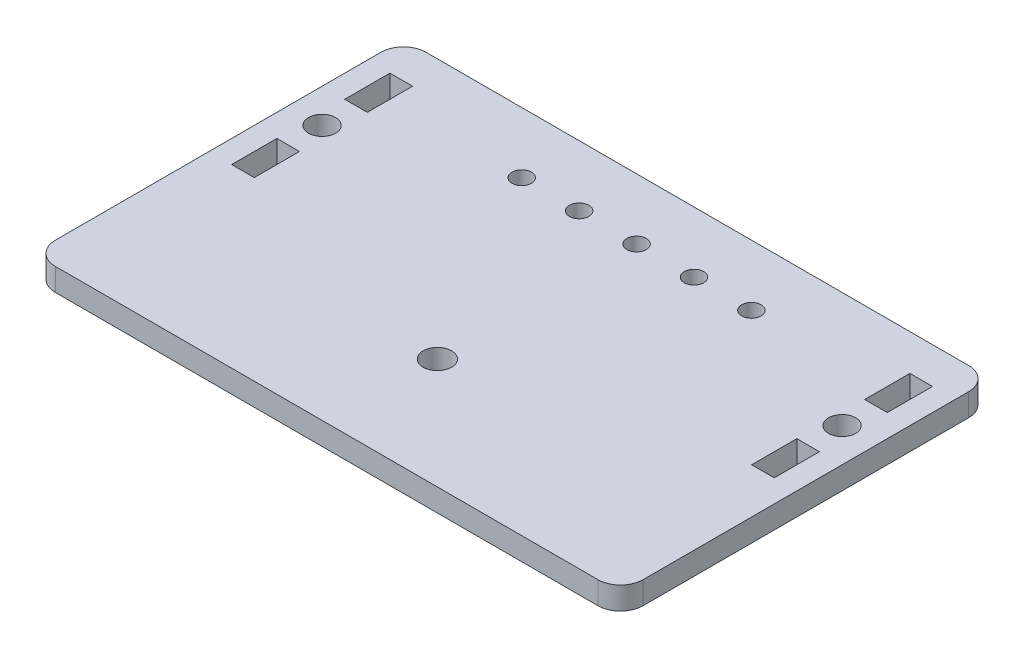
ISO-10303-21;
HEADER;
FILE_DESCRIPTION(('STEP AP214'),'2;1');
FILE_NAME('part.step','',(''),(''),'','','');
FILE_SCHEMA(('AUTOMOTIVE_DESIGN { 1 0 10303 214 1 1 1 1 }'));
ENDSEC;
DATA;
#1=APPLICATION_CONTEXT('core data for automotive mechanical design processes');
#2=APPLICATION_PROTOCOL_DEFINITION('international standard','automotive_design',2000,#1);
#3=PRODUCT_CONTEXT('',#1,'mechanical');
#4=PRODUCT('Part','Part','',(#3));
#5=PRODUCT_RELATED_PRODUCT_CATEGORY('part','',(#4));
#6=PRODUCT_DEFINITION_FORMATION('','',#4);
#7=PRODUCT_DEFINITION_CONTEXT('part definition',#1,'design');
#8=PRODUCT_DEFINITION('design','',#6,#7);
#9=PRODUCT_DEFINITION_SHAPE('','',#8);
#10=(LENGTH_UNIT() NAMED_UNIT(*) SI_UNIT(.MILLI.,.METRE.));
#11=(NAMED_UNIT(*) PLANE_ANGLE_UNIT() SI_UNIT($,.RADIAN.));
#12=(NAMED_UNIT(*) SI_UNIT($,.STERADIAN.) SOLID_ANGLE_UNIT());
#13=UNCERTAINTY_MEASURE_WITH_UNIT(LENGTH_MEASURE(1.E-05),#10,'distance_accuracy_value','');
#14=(GEOMETRIC_REPRESENTATION_CONTEXT(3) GLOBAL_UNCERTAINTY_ASSIGNED_CONTEXT((#13)) GLOBAL_UNIT_ASSIGNED_CONTEXT((#10,
#11,#12)) REPRESENTATION_CONTEXT('',''));
#15=CARTESIAN_POINT('',(0.,0.,0.));
#16=DIRECTION('',(0.,0.,1.));
#17=DIRECTION('',(1.,0.,0.));
#18=AXIS2_PLACEMENT_3D('',#15,#16,#17);
#19=CARTESIAN_POINT('',(65.,5.,-25.));
#20=DIRECTION('',(-1.,0.,0.));
#21=DIRECTION('',(0.,0.,1.));
#22=AXIS2_PLACEMENT_3D('',#19,#20,#21);
#23=PLANE('',#22);
#24=DIRECTION('',(0.,0.,-1.));
#25=VECTOR('',#24,1.);
#26=CARTESIAN_POINT('',(65.,0.,-25.));
#27=LINE('',#26,#25);
#28=CARTESIAN_POINT('',(65.,0.,20.));
#29=VERTEX_POINT('',#28);
#30=CARTESIAN_POINT('',(65.,0.,-52.));
#31=VERTEX_POINT('',#30);
#32=EDGE_CURVE('E303',#29,#31,#27,.T.);
#33=ORIENTED_EDGE('',*,*,#32,.T.);
#34=DIRECTION('',(0.,-1.,0.));
#35=VECTOR('',#34,1.);
#36=CARTESIAN_POINT('',(65.,5.,-52.));
#37=LINE('',#36,#35);
#38=CARTESIAN_POINT('',(65.,5.,-52.));
#39=VERTEX_POINT('',#38);
#40=EDGE_CURVE('E384',#31,#39,#37,.F.);
#41=ORIENTED_EDGE('',*,*,#40,.T.);
#42=DIRECTION('',(0.,0.,-1.));
#43=VECTOR('',#42,1.);
#44=CARTESIAN_POINT('',(65.,5.,-25.));
#45=LINE('',#44,#43);
#46=CARTESIAN_POINT('',(65.,5.,20.));
#47=VERTEX_POINT('',#46);
#48=EDGE_CURVE('E304',#47,#39,#45,.T.);
#49=ORIENTED_EDGE('',*,*,#48,.F.);
#50=DIRECTION('',(0.,-1.,0.));
#51=VECTOR('',#50,1.);
#52=CARTESIAN_POINT('',(65.,5.,20.));
#53=LINE('',#52,#51);
#54=EDGE_CURVE('E381',#47,#29,#53,.T.);
#55=ORIENTED_EDGE('',*,*,#54,.T.);
#56=EDGE_LOOP('',(#33,#41,#49,#55));
#57=FACE_BOUND('',#56,.T.);
#58=ADVANCED_FACE('F32',(#57),#23,.F.);
#59=CARTESIAN_POINT('',(-65.,5.,-25.));
#60=DIRECTION('',(1.,0.,0.));
#61=DIRECTION('',(0.,0.,-1.));
#62=AXIS2_PLACEMENT_3D('',#59,#60,#61);
#63=PLANE('',#62);
#64=DIRECTION('',(0.,0.,1.));
#65=VECTOR('',#64,1.);
#66=CARTESIAN_POINT('',(-65.,0.,-25.));
#67=LINE('',#66,#65);
#68=CARTESIAN_POINT('',(-65.,0.,-52.));
#69=VERTEX_POINT('',#68);
#70=CARTESIAN_POINT('',(-65.,0.,20.));
#71=VERTEX_POINT('',#70);
#72=EDGE_CURVE('E315',#69,#71,#67,.T.);
#73=ORIENTED_EDGE('',*,*,#72,.T.);
#74=DIRECTION('',(0.,-1.,0.));
#75=VECTOR('',#74,1.);
#76=CARTESIAN_POINT('',(-65.,5.,20.));
#77=LINE('',#76,#75);
#78=CARTESIAN_POINT('',(-65.,5.,20.));
#79=VERTEX_POINT('',#78);
#80=EDGE_CURVE('E11',#71,#79,#77,.F.);
#81=ORIENTED_EDGE('',*,*,#80,.T.);
#82=DIRECTION('',(0.,0.,1.));
#83=VECTOR('',#82,1.);
#84=CARTESIAN_POINT('',(-65.,5.,-25.));
#85=LINE('',#84,#83);
#86=CARTESIAN_POINT('',(-65.,5.,-52.));
#87=VERTEX_POINT('',#86);
#88=EDGE_CURVE('E307',#87,#79,#85,.T.);
#89=ORIENTED_EDGE('',*,*,#88,.F.);
#90=DIRECTION('',(0.,1.,0.));
#91=VECTOR('',#90,1.);
#92=CARTESIAN_POINT('',(-65.,0.,-52.));
#93=LINE('',#92,#91);
#94=EDGE_CURVE('E40',#87,#69,#93,.F.);
#95=ORIENTED_EDGE('',*,*,#94,.T.);
#96=EDGE_LOOP('',(#73,#81,#89,#95));
#97=FACE_BOUND('',#96,.T.);
#98=ADVANCED_FACE('F400',(#97),#63,.F.);
#99=CARTESIAN_POINT('',(-65.,5.,25.));
#100=DIRECTION('',(0.,0.,-1.));
#101=DIRECTION('',(-1.,0.,0.));
#102=AXIS2_PLACEMENT_3D('',#99,#100,#101);
#103=PLANE('',#102);
#104=DIRECTION('',(1.,0.,0.));
#105=VECTOR('',#104,1.);
#106=CARTESIAN_POINT('',(-65.,5.,25.));
#107=LINE('',#106,#105);
#108=CARTESIAN_POINT('',(-60.,5.,25.));
#109=VERTEX_POINT('',#108);
#110=CARTESIAN_POINT('',(60.,5.,25.));
#111=VERTEX_POINT('',#110);
#112=EDGE_CURVE('E310',#109,#111,#107,.T.);
#113=ORIENTED_EDGE('',*,*,#112,.F.);
#114=DIRECTION('',(0.,-1.,0.));
#115=VECTOR('',#114,1.);
#116=CARTESIAN_POINT('',(-60.,5.,25.));
#117=LINE('',#116,#115);
#118=CARTESIAN_POINT('',(-60.,0.,25.));
#119=VERTEX_POINT('',#118);
#120=EDGE_CURVE('E394',#109,#119,#117,.T.);
#121=ORIENTED_EDGE('',*,*,#120,.T.);
#122=DIRECTION('',(1.,0.,0.));
#123=VECTOR('',#122,1.);
#124=CARTESIAN_POINT('',(-65.,0.,25.));
#125=LINE('',#124,#123);
#126=CARTESIAN_POINT('',(60.,0.,25.));
#127=VERTEX_POINT('',#126);
#128=EDGE_CURVE('E308',#119,#127,#125,.T.);
#129=ORIENTED_EDGE('',*,*,#128,.T.);
#130=DIRECTION('',(0.,-1.,0.));
#131=VECTOR('',#130,1.);
#132=CARTESIAN_POINT('',(60.,5.,25.));
#133=LINE('',#132,#131);
#134=EDGE_CURVE('E47',#127,#111,#133,.F.);
#135=ORIENTED_EDGE('',*,*,#134,.T.);
#136=EDGE_LOOP('',(#113,#121,#129,#135));
#137=FACE_BOUND('',#136,.T.);
#138=ADVANCED_FACE('F424',(#137),#103,.F.);
#139=CARTESIAN_POINT('',(0.,5.,0.));
#140=DIRECTION('',(0.,1.,0.));
#141=DIRECTION('',(0.,0.,1.));
#142=AXIS2_PLACEMENT_3D('',#139,#140,#141);
#143=PLANE('',#142);
#144=CARTESIAN_POINT('',(0.,5.,-43.55));
#145=DIRECTION('',(0.,1.,0.));
#146=DIRECTION('',(0.,0.,1.));
#147=AXIS2_PLACEMENT_3D('',#144,#145,#146);
#148=CIRCLE('',#147,2.15);
#149=CARTESIAN_POINT('',(0.,5.,-41.4));
#150=VERTEX_POINT('',#149);
#151=EDGE_CURVE('E549',#150,#150,#148,.T.);
#152=ORIENTED_EDGE('',*,*,#151,.F.);
#153=EDGE_LOOP('',(#152));
#154=FACE_BOUND('',#153,.T.);
#155=CARTESIAN_POINT('',(12.7,5.,-43.55));
#156=DIRECTION('',(0.,1.,0.));
#157=DIRECTION('',(0.,0.,-1.));
#158=AXIS2_PLACEMENT_3D('',#155,#156,#157);
#159=CIRCLE('',#158,2.15);
#160=CARTESIAN_POINT('',(12.7,5.,-45.7));
#161=VERTEX_POINT('',#160);
#162=EDGE_CURVE('E553',#161,#161,#159,.T.);
#163=ORIENTED_EDGE('',*,*,#162,.F.);
#164=EDGE_LOOP('',(#163));
#165=FACE_BOUND('',#164,.T.);
#166=CARTESIAN_POINT('',(-12.7,5.,-43.55));
#167=DIRECTION('',(0.,1.,0.));
#168=DIRECTION('',(0.,0.,1.));
#169=AXIS2_PLACEMENT_3D('',#166,#167,#168);
#170=CIRCLE('',#169,2.15);
#171=CARTESIAN_POINT('',(-12.7,5.,-41.4));
#172=VERTEX_POINT('',#171);
#173=EDGE_CURVE('E562',#172,#172,#170,.T.);
#174=ORIENTED_EDGE('',*,*,#173,.F.);
#175=EDGE_LOOP('',(#174));
#176=FACE_BOUND('',#175,.T.);
#177=CARTESIAN_POINT('',(-25.4,5.,-43.55));
#178=DIRECTION('',(0.,1.,0.));
#179=DIRECTION('',(0.,0.,1.));
#180=AXIS2_PLACEMENT_3D('',#177,#178,#179);
#181=CIRCLE('',#180,2.15);
#182=CARTESIAN_POINT('',(-25.4,5.,-41.4));
#183=VERTEX_POINT('',#182);
#184=EDGE_CURVE('E568',#183,#183,#181,.T.);
#185=ORIENTED_EDGE('',*,*,#184,.F.);
#186=EDGE_LOOP('',(#185));
#187=FACE_BOUND('',#186,.T.);
#188=CARTESIAN_POINT('',(25.4,5.,-43.55));
#189=DIRECTION('',(0.,1.,0.));
#190=DIRECTION('',(0.,0.,1.));
#191=AXIS2_PLACEMENT_3D('',#188,#189,#190);
#192=CIRCLE('',#191,2.15);
#193=CARTESIAN_POINT('',(25.4,5.,-41.4));
#194=VERTEX_POINT('',#193);
#195=EDGE_CURVE('E574',#194,#194,#192,.T.);
#196=ORIENTED_EDGE('',*,*,#195,.F.);
#197=EDGE_LOOP('',(#196));
#198=FACE_BOUND('',#197,.T.);
#199=CARTESIAN_POINT('',(0.,5.,0.499999999999973));
#200=DIRECTION('',(0.,1.,0.));
#201=DIRECTION('',(0.,0.,1.));
#202=AXIS2_PLACEMENT_3D('',#199,#200,#201);
#203=CIRCLE('',#202,3.15);
#204=CARTESIAN_POINT('',(0.,5.,3.64999999999997));
#205=VERTEX_POINT('',#204);
#206=EDGE_CURVE('E580',#205,#205,#203,.T.);
#207=ORIENTED_EDGE('',*,*,#206,.F.);
#208=EDGE_LOOP('',(#207));
#209=FACE_BOUND('',#208,.T.);
#210=DIRECTION('',(-1.,0.,0.));
#211=VECTOR('',#210,1.);
#212=CARTESIAN_POINT('',(60.,5.,-24.));
#213=LINE('',#212,#211);
#214=CARTESIAN_POINT('',(60.,5.,-24.));
#215=VERTEX_POINT('',#214);
#216=CARTESIAN_POINT('',(55.,5.,-24.));
#217=VERTEX_POINT('',#216);
#218=EDGE_CURVE('E215',#215,#217,#213,.T.);
#219=ORIENTED_EDGE('',*,*,#218,.F.);
#220=DIRECTION('',(0.,0.,-1.));
#221=VECTOR('',#220,1.);
#222=CARTESIAN_POINT('',(60.,5.,-24.));
#223=LINE('',#222,#221);
#224=CARTESIAN_POINT('',(60.,5.,-14.));
#225=VERTEX_POINT('',#224);
#226=EDGE_CURVE('E220',#225,#215,#223,.T.);
#227=ORIENTED_EDGE('',*,*,#226,.F.);
#228=DIRECTION('',(1.,0.,0.));
#229=VECTOR('',#228,1.);
#230=CARTESIAN_POINT('',(60.,5.,-14.));
#231=LINE('',#230,#229);
#232=CARTESIAN_POINT('',(55.,5.,-14.));
#233=VERTEX_POINT('',#232);
#234=EDGE_CURVE('E199',#233,#225,#231,.T.);
#235=ORIENTED_EDGE('',*,*,#234,.F.);
#236=DIRECTION('',(0.,0.,1.));
#237=VECTOR('',#236,1.);
#238=CARTESIAN_POINT('',(55.,5.,-24.));
#239=LINE('',#238,#237);
#240=EDGE_CURVE('E210',#217,#233,#239,.T.);
#241=ORIENTED_EDGE('',*,*,#240,.F.);
#242=EDGE_LOOP('',(#219,#227,#235,#241));
#243=FACE_BOUND('',#242,.T.);
#244=DIRECTION('',(-1.,0.,0.));
#245=VECTOR('',#244,1.);
#246=CARTESIAN_POINT('',(60.,5.,-49.));
#247=LINE('',#246,#245);
#248=CARTESIAN_POINT('',(60.,5.,-49.));
#249=VERTEX_POINT('',#248);
#250=CARTESIAN_POINT('',(55.,5.,-49.));
#251=VERTEX_POINT('',#250);
#252=EDGE_CURVE('E227',#249,#251,#247,.T.);
#253=ORIENTED_EDGE('',*,*,#252,.F.);
#254=DIRECTION('',(0.,0.,-1.));
#255=VECTOR('',#254,1.);
#256=CARTESIAN_POINT('',(60.,5.,-49.));
#257=LINE('',#256,#255);
#258=CARTESIAN_POINT('',(60.,5.,-39.));
#259=VERTEX_POINT('',#258);
#260=EDGE_CURVE('E237',#259,#249,#257,.T.);
#261=ORIENTED_EDGE('',*,*,#260,.F.);
#262=DIRECTION('',(1.,0.,0.));
#263=VECTOR('',#262,1.);
#264=CARTESIAN_POINT('',(60.,5.,-39.));
#265=LINE('',#264,#263);
#266=CARTESIAN_POINT('',(55.,5.,-39.));
#267=VERTEX_POINT('',#266);
#268=EDGE_CURVE('E234',#267,#259,#265,.T.);
#269=ORIENTED_EDGE('',*,*,#268,.F.);
#270=DIRECTION('',(0.,0.,1.));
#271=VECTOR('',#270,1.);
#272=CARTESIAN_POINT('',(55.,5.,-49.));
#273=LINE('',#272,#271);
#274=EDGE_CURVE('E231',#251,#267,#273,.T.);
#275=ORIENTED_EDGE('',*,*,#274,.F.);
#276=EDGE_LOOP('',(#253,#261,#269,#275));
#277=FACE_BOUND('',#276,.T.);
#278=CARTESIAN_POINT('',(57.5,5.,-31.5));
#279=DIRECTION('',(0.,1.,0.));
#280=DIRECTION('',(0.,0.,-1.));
#281=AXIS2_PLACEMENT_3D('',#278,#279,#280);
#282=CIRCLE('',#281,3.);
#283=CARTESIAN_POINT('',(57.5,5.,-34.5));
#284=VERTEX_POINT('',#283);
#285=EDGE_CURVE('E243',#284,#284,#282,.T.);
#286=ORIENTED_EDGE('',*,*,#285,.F.);
#287=EDGE_LOOP('',(#286));
#288=FACE_BOUND('',#287,.T.);
#289=CARTESIAN_POINT('',(-57.5,5.,-31.5));
#290=DIRECTION('',(0.,1.,0.));
#291=DIRECTION('',(0.,0.,1.));
#292=AXIS2_PLACEMENT_3D('',#289,#290,#291);
#293=CIRCLE('',#292,3.);
#294=CARTESIAN_POINT('',(-57.5,5.,-28.5));
#295=VERTEX_POINT('',#294);
#296=EDGE_CURVE('E253',#295,#295,#293,.T.);
#297=ORIENTED_EDGE('',*,*,#296,.F.);
#298=EDGE_LOOP('',(#297));
#299=FACE_BOUND('',#298,.T.);
#300=DIRECTION('',(0.,0.,1.));
#301=VECTOR('',#300,1.);
#302=CARTESIAN_POINT('',(-60.,5.,-49.));
#303=LINE('',#302,#301);
#304=CARTESIAN_POINT('',(-60.,5.,-49.));
#305=VERTEX_POINT('',#304);
#306=CARTESIAN_POINT('',(-60.,5.,-39.));
#307=VERTEX_POINT('',#306);
#308=EDGE_CURVE('E257',#305,#307,#303,.T.);
#309=ORIENTED_EDGE('',*,*,#308,.F.);
#310=DIRECTION('',(-1.,0.,0.));
#311=VECTOR('',#310,1.);
#312=CARTESIAN_POINT('',(-60.,5.,-49.));
#313=LINE('',#312,#311);
#314=CARTESIAN_POINT('',(-55.,5.,-49.));
#315=VERTEX_POINT('',#314);
#316=EDGE_CURVE('E265',#315,#305,#313,.T.);
#317=ORIENTED_EDGE('',*,*,#316,.F.);
#318=DIRECTION('',(0.,0.,-1.));
#319=VECTOR('',#318,1.);
#320=CARTESIAN_POINT('',(-55.,5.,-49.));
#321=LINE('',#320,#319);
#322=CARTESIAN_POINT('',(-55.,5.,-39.));
#323=VERTEX_POINT('',#322);
#324=EDGE_CURVE('E262',#323,#315,#321,.T.);
#325=ORIENTED_EDGE('',*,*,#324,.F.);
#326=DIRECTION('',(1.,0.,0.));
#327=VECTOR('',#326,1.);
#328=CARTESIAN_POINT('',(-60.,5.,-39.));
#329=LINE('',#328,#327);
#330=EDGE_CURVE('E259',#307,#323,#329,.T.);
#331=ORIENTED_EDGE('',*,*,#330,.F.);
#332=EDGE_LOOP('',(#309,#317,#325,#331));
#333=FACE_BOUND('',#332,.T.);
#334=DIRECTION('',(0.,0.,1.));
#335=VECTOR('',#334,1.);
#336=CARTESIAN_POINT('',(-60.,5.,-24.));
#337=LINE('',#336,#335);
#338=CARTESIAN_POINT('',(-60.,5.,-24.));
#339=VERTEX_POINT('',#338);
#340=CARTESIAN_POINT('',(-60.,5.,-14.));
#341=VERTEX_POINT('',#340);
#342=EDGE_CURVE('E271',#339,#341,#337,.T.);
#343=ORIENTED_EDGE('',*,*,#342,.F.);
#344=DIRECTION('',(-1.,0.,0.));
#345=VECTOR('',#344,1.);
#346=CARTESIAN_POINT('',(-60.,5.,-24.));
#347=LINE('',#346,#345);
#348=CARTESIAN_POINT('',(-55.,5.,-24.));
#349=VERTEX_POINT('',#348);
#350=EDGE_CURVE('E285',#349,#339,#347,.T.);
#351=ORIENTED_EDGE('',*,*,#350,.F.);
#352=DIRECTION('',(0.,0.,-1.));
#353=VECTOR('',#352,1.);
#354=CARTESIAN_POINT('',(-55.,5.,-24.));
#355=LINE('',#354,#353);
#356=CARTESIAN_POINT('',(-55.,5.,-14.));
#357=VERTEX_POINT('',#356);
#358=EDGE_CURVE('E282',#357,#349,#355,.T.);
#359=ORIENTED_EDGE('',*,*,#358,.F.);
#360=DIRECTION('',(1.,0.,0.));
#361=VECTOR('',#360,1.);
#362=CARTESIAN_POINT('',(-60.,5.,-14.));
#363=LINE('',#362,#361);
#364=EDGE_CURVE('E279',#341,#357,#363,.T.);
#365=ORIENTED_EDGE('',*,*,#364,.F.);
#366=EDGE_LOOP('',(#343,#351,#359,#365));
#367=FACE_BOUND('',#366,.T.);
#368=ORIENTED_EDGE('',*,*,#48,.T.);
#369=CARTESIAN_POINT('',(60.,5.,-52.));
#370=DIRECTION('',(0.,1.,0.));
#371=DIRECTION('',(0.,0.,1.));
#372=AXIS2_PLACEMENT_3D('',#369,#370,#371);
#373=CIRCLE('',#372,5.);
#374=CARTESIAN_POINT('',(60.,5.,-57.));
#375=VERTEX_POINT('',#374);
#376=EDGE_CURVE('E391',#39,#375,#373,.T.);
#377=ORIENTED_EDGE('',*,*,#376,.T.);
#378=DIRECTION('',(1.,0.,0.));
#379=VECTOR('',#378,1.);
#380=CARTESIAN_POINT('',(-65.,5.,-57.));
#381=LINE('',#380,#379);
#382=CARTESIAN_POINT('',(-60.,5.,-57.));
#383=VERTEX_POINT('',#382);
#384=EDGE_CURVE('E300',#383,#375,#381,.T.);
#385=ORIENTED_EDGE('',*,*,#384,.F.);
#386=CARTESIAN_POINT('',(-60.,5.,-52.));
#387=DIRECTION('',(0.,1.,0.));
#388=DIRECTION('',(0.,0.,1.));
#389=AXIS2_PLACEMENT_3D('',#386,#387,#388);
#390=CIRCLE('',#389,5.);
#391=EDGE_CURVE('E386',#383,#87,#390,.T.);
#392=ORIENTED_EDGE('',*,*,#391,.T.);
#393=ORIENTED_EDGE('',*,*,#88,.T.);
#394=CARTESIAN_POINT('',(-60.,5.,20.));
#395=DIRECTION('',(0.,1.,0.));
#396=DIRECTION('',(0.,0.,1.));
#397=AXIS2_PLACEMENT_3D('',#394,#395,#396);
#398=CIRCLE('',#397,5.);
#399=EDGE_CURVE('E54',#79,#109,#398,.T.);
#400=ORIENTED_EDGE('',*,*,#399,.T.);
#401=ORIENTED_EDGE('',*,*,#112,.T.);
#402=CARTESIAN_POINT('',(60.,5.,20.));
#403=DIRECTION('',(0.,1.,0.));
#404=DIRECTION('',(0.,0.,1.));
#405=AXIS2_PLACEMENT_3D('',#402,#403,#404);
#406=CIRCLE('',#405,5.);
#407=EDGE_CURVE('E388',#111,#47,#406,.T.);
#408=ORIENTED_EDGE('',*,*,#407,.T.);
#409=EDGE_LOOP('',(#368,#377,#385,#392,#393,#400,#401,#408));
#410=FACE_BOUND('',#409,.T.);
#411=ADVANCED_FACE('F217',(#154,#165,#176,#187,#198,#209,#243,#277,#288,#299,#333,#367,#410),
#143,.T.);
#412=CARTESIAN_POINT('',(0.,0.,0.));
#413=DIRECTION('',(0.,1.,0.));
#414=DIRECTION('',(0.,0.,1.));
#415=AXIS2_PLACEMENT_3D('',#412,#413,#414);
#416=PLANE('',#415);
#417=CARTESIAN_POINT('',(0.,0.,-43.55));
#418=DIRECTION('',(0.,1.,0.));
#419=DIRECTION('',(0.,0.,1.));
#420=AXIS2_PLACEMENT_3D('',#417,#418,#419);
#421=CIRCLE('',#420,2.15);
#422=CARTESIAN_POINT('',(0.,0.,-41.4));
#423=VERTEX_POINT('',#422);
#424=EDGE_CURVE('E552',#423,#423,#421,.F.);
#425=ORIENTED_EDGE('',*,*,#424,.F.);
#426=EDGE_LOOP('',(#425));
#427=FACE_BOUND('',#426,.T.);
#428=CARTESIAN_POINT('',(12.7,0.,-43.55));
#429=DIRECTION('',(0.,1.,0.));
#430=DIRECTION('',(0.,0.,1.));
#431=AXIS2_PLACEMENT_3D('',#428,#429,#430);
#432=CIRCLE('',#431,2.15);
#433=CARTESIAN_POINT('',(12.7,0.,-41.4));
#434=VERTEX_POINT('',#433);
#435=EDGE_CURVE('E556',#434,#434,#432,.F.);
#436=ORIENTED_EDGE('',*,*,#435,.F.);
#437=EDGE_LOOP('',(#436));
#438=FACE_BOUND('',#437,.T.);
#439=CARTESIAN_POINT('',(-12.7,0.,-43.55));
#440=DIRECTION('',(0.,1.,0.));
#441=DIRECTION('',(0.,0.,1.));
#442=AXIS2_PLACEMENT_3D('',#439,#440,#441);
#443=CIRCLE('',#442,2.15);
#444=CARTESIAN_POINT('',(-12.7,0.,-41.4));
#445=VERTEX_POINT('',#444);
#446=EDGE_CURVE('E565',#445,#445,#443,.F.);
#447=ORIENTED_EDGE('',*,*,#446,.F.);
#448=EDGE_LOOP('',(#447));
#449=FACE_BOUND('',#448,.T.);
#450=CARTESIAN_POINT('',(-25.4,0.,-43.55));
#451=DIRECTION('',(0.,1.,0.));
#452=DIRECTION('',(0.,0.,1.));
#453=AXIS2_PLACEMENT_3D('',#450,#451,#452);
#454=CIRCLE('',#453,2.15);
#455=CARTESIAN_POINT('',(-25.4,0.,-41.4));
#456=VERTEX_POINT('',#455);
#457=EDGE_CURVE('E571',#456,#456,#454,.F.);
#458=ORIENTED_EDGE('',*,*,#457,.F.);
#459=EDGE_LOOP('',(#458));
#460=FACE_BOUND('',#459,.T.);
#461=CARTESIAN_POINT('',(25.4,0.,-43.55));
#462=DIRECTION('',(0.,1.,0.));
#463=DIRECTION('',(0.,0.,1.));
#464=AXIS2_PLACEMENT_3D('',#461,#462,#463);
#465=CIRCLE('',#464,2.15);
#466=CARTESIAN_POINT('',(25.4,0.,-41.4));
#467=VERTEX_POINT('',#466);
#468=EDGE_CURVE('E577',#467,#467,#465,.F.);
#469=ORIENTED_EDGE('',*,*,#468,.F.);
#470=EDGE_LOOP('',(#469));
#471=FACE_BOUND('',#470,.T.);
#472=CARTESIAN_POINT('',(0.,0.,0.499999999999973));
#473=DIRECTION('',(0.,1.,0.));
#474=DIRECTION('',(0.,0.,1.));
#475=AXIS2_PLACEMENT_3D('',#472,#473,#474);
#476=CIRCLE('',#475,3.15);
#477=CARTESIAN_POINT('',(0.,0.,3.64999999999997));
#478=VERTEX_POINT('',#477);
#479=EDGE_CURVE('E583',#478,#478,#476,.F.);
#480=ORIENTED_EDGE('',*,*,#479,.F.);
#481=EDGE_LOOP('',(#480));
#482=FACE_BOUND('',#481,.T.);
#483=DIRECTION('',(0.,0.,-1.));
#484=VECTOR('',#483,1.);
#485=CARTESIAN_POINT('',(60.,0.,0.));
#486=LINE('',#485,#484);
#487=CARTESIAN_POINT('',(60.,0.,-14.));
#488=VERTEX_POINT('',#487);
#489=CARTESIAN_POINT('',(60.,0.,-24.));
#490=VERTEX_POINT('',#489);
#491=EDGE_CURVE('E361',#488,#490,#486,.T.);
#492=ORIENTED_EDGE('',*,*,#491,.T.);
#493=DIRECTION('',(-1.,0.,0.));
#494=VECTOR('',#493,1.);
#495=CARTESIAN_POINT('',(0.,0.,-24.));
#496=LINE('',#495,#494);
#497=CARTESIAN_POINT('',(55.,0.,-24.));
#498=VERTEX_POINT('',#497);
#499=EDGE_CURVE('E364',#490,#498,#496,.T.);
#500=ORIENTED_EDGE('',*,*,#499,.T.);
#501=DIRECTION('',(0.,0.,1.));
#502=VECTOR('',#501,1.);
#503=CARTESIAN_POINT('',(55.,0.,0.));
#504=LINE('',#503,#502);
#505=CARTESIAN_POINT('',(55.,0.,-14.));
#506=VERTEX_POINT('',#505);
#507=EDGE_CURVE('E358',#498,#506,#504,.T.);
#508=ORIENTED_EDGE('',*,*,#507,.T.);
#509=DIRECTION('',(1.,0.,0.));
#510=VECTOR('',#509,1.);
#511=CARTESIAN_POINT('',(0.,0.,-14.));
#512=LINE('',#511,#510);
#513=EDGE_CURVE('E202',#506,#488,#512,.T.);
#514=ORIENTED_EDGE('',*,*,#513,.T.);
#515=EDGE_LOOP('',(#492,#500,#508,#514));
#516=FACE_BOUND('',#515,.T.);
#517=DIRECTION('',(0.,0.,-1.));
#518=VECTOR('',#517,1.);
#519=CARTESIAN_POINT('',(60.,0.,0.));
#520=LINE('',#519,#518);
#521=CARTESIAN_POINT('',(60.,0.,-39.));
#522=VERTEX_POINT('',#521);
#523=CARTESIAN_POINT('',(60.,0.,-49.));
#524=VERTEX_POINT('',#523);
#525=EDGE_CURVE('E352',#522,#524,#520,.T.);
#526=ORIENTED_EDGE('',*,*,#525,.T.);
#527=DIRECTION('',(-1.,0.,0.));
#528=VECTOR('',#527,1.);
#529=CARTESIAN_POINT('',(0.,0.,-49.0000000000001));
#530=LINE('',#529,#528);
#531=CARTESIAN_POINT('',(55.,0.,-49.));
#532=VERTEX_POINT('',#531);
#533=EDGE_CURVE('E355',#524,#532,#530,.T.);
#534=ORIENTED_EDGE('',*,*,#533,.T.);
#535=DIRECTION('',(0.,0.,1.));
#536=VECTOR('',#535,1.);
#537=CARTESIAN_POINT('',(55.,0.,0.));
#538=LINE('',#537,#536);
#539=CARTESIAN_POINT('',(55.,0.,-39.));
#540=VERTEX_POINT('',#539);
#541=EDGE_CURVE('E342',#532,#540,#538,.T.);
#542=ORIENTED_EDGE('',*,*,#541,.T.);
#543=DIRECTION('',(1.,0.,0.));
#544=VECTOR('',#543,1.);
#545=CARTESIAN_POINT('',(0.,0.,-39.));
#546=LINE('',#545,#544);
#547=EDGE_CURVE('E349',#540,#522,#546,.T.);
#548=ORIENTED_EDGE('',*,*,#547,.T.);
#549=EDGE_LOOP('',(#526,#534,#542,#548));
#550=FACE_BOUND('',#549,.T.);
#551=CARTESIAN_POINT('',(57.5,0.,-31.5));
#552=DIRECTION('',(0.,1.,0.));
#553=DIRECTION('',(0.,0.,1.));
#554=AXIS2_PLACEMENT_3D('',#551,#552,#553);
#555=CIRCLE('',#554,3.);
#556=CARTESIAN_POINT('',(57.5,0.,-28.5));
#557=VERTEX_POINT('',#556);
#558=EDGE_CURVE('E252',#557,#557,#555,.T.);
#559=ORIENTED_EDGE('',*,*,#558,.T.);
#560=EDGE_LOOP('',(#559));
#561=FACE_BOUND('',#560,.T.);
#562=CARTESIAN_POINT('',(-57.5,0.,-31.5));
#563=DIRECTION('',(0.,1.,0.));
#564=DIRECTION('',(0.,0.,1.));
#565=AXIS2_PLACEMENT_3D('',#562,#563,#564);
#566=CIRCLE('',#565,3.);
#567=CARTESIAN_POINT('',(-57.5,0.,-28.5));
#568=VERTEX_POINT('',#567);
#569=EDGE_CURVE('E256',#568,#568,#566,.T.);
#570=ORIENTED_EDGE('',*,*,#569,.T.);
#571=EDGE_LOOP('',(#570));
#572=FACE_BOUND('',#571,.T.);
#573=DIRECTION('',(-1.,0.,0.));
#574=VECTOR('',#573,1.);
#575=CARTESIAN_POINT('',(0.,0.,-49.0000000000001));
#576=LINE('',#575,#574);
#577=CARTESIAN_POINT('',(-55.,0.,-49.));
#578=VERTEX_POINT('',#577);
#579=CARTESIAN_POINT('',(-60.,0.,-49.));
#580=VERTEX_POINT('',#579);
#581=EDGE_CURVE('E336',#578,#580,#576,.T.);
#582=ORIENTED_EDGE('',*,*,#581,.T.);
#583=DIRECTION('',(0.,0.,1.));
#584=VECTOR('',#583,1.);
#585=CARTESIAN_POINT('',(-60.,0.,0.));
#586=LINE('',#585,#584);
#587=CARTESIAN_POINT('',(-60.,0.,-39.));
#588=VERTEX_POINT('',#587);
#589=EDGE_CURVE('E339',#580,#588,#586,.T.);
#590=ORIENTED_EDGE('',*,*,#589,.T.);
#591=DIRECTION('',(1.,0.,0.));
#592=VECTOR('',#591,1.);
#593=CARTESIAN_POINT('',(0.,0.,-39.));
#594=LINE('',#593,#592);
#595=CARTESIAN_POINT('',(-55.,0.,-39.));
#596=VERTEX_POINT('',#595);
#597=EDGE_CURVE('E330',#588,#596,#594,.T.);
#598=ORIENTED_EDGE('',*,*,#597,.T.);
#599=DIRECTION('',(0.,0.,-1.));
#600=VECTOR('',#599,1.);
#601=CARTESIAN_POINT('',(-55.,0.,0.));
#602=LINE('',#601,#600);
#603=EDGE_CURVE('E333',#596,#578,#602,.T.);
#604=ORIENTED_EDGE('',*,*,#603,.T.);
#605=EDGE_LOOP('',(#582,#590,#598,#604));
#606=FACE_BOUND('',#605,.T.);
#607=DIRECTION('',(-1.,0.,0.));
#608=VECTOR('',#607,1.);
#609=CARTESIAN_POINT('',(0.,0.,-24.));
#610=LINE('',#609,#608);
#611=CARTESIAN_POINT('',(-55.,0.,-24.));
#612=VERTEX_POINT('',#611);
#613=CARTESIAN_POINT('',(-60.,0.,-24.));
#614=VERTEX_POINT('',#613);
#615=EDGE_CURVE('E324',#612,#614,#610,.T.);
#616=ORIENTED_EDGE('',*,*,#615,.T.);
#617=DIRECTION('',(0.,0.,1.));
#618=VECTOR('',#617,1.);
#619=CARTESIAN_POINT('',(-60.,0.,0.));
#620=LINE('',#619,#618);
#621=CARTESIAN_POINT('',(-60.,0.,-14.));
#622=VERTEX_POINT('',#621);
#623=EDGE_CURVE('E327',#614,#622,#620,.T.);
#624=ORIENTED_EDGE('',*,*,#623,.T.);
#625=DIRECTION('',(1.,0.,0.));
#626=VECTOR('',#625,1.);
#627=CARTESIAN_POINT('',(0.,0.,-13.9999999999999));
#628=LINE('',#627,#626);
#629=CARTESIAN_POINT('',(-55.,0.,-14.));
#630=VERTEX_POINT('',#629);
#631=EDGE_CURVE('E312',#622,#630,#628,.T.);
#632=ORIENTED_EDGE('',*,*,#631,.T.);
#633=DIRECTION('',(0.,0.,-1.));
#634=VECTOR('',#633,1.);
#635=CARTESIAN_POINT('',(-55.,0.,0.));
#636=LINE('',#635,#634);
#637=EDGE_CURVE('E321',#630,#612,#636,.T.);
#638=ORIENTED_EDGE('',*,*,#637,.T.);
#639=EDGE_LOOP('',(#616,#624,#632,#638));
#640=FACE_BOUND('',#639,.T.);
#641=DIRECTION('',(-1.,0.,0.));
#642=VECTOR('',#641,1.);
#643=CARTESIAN_POINT('',(65.,0.,-57.));
#644=LINE('',#643,#642);
#645=CARTESIAN_POINT('',(60.,0.,-57.));
#646=VERTEX_POINT('',#645);
#647=CARTESIAN_POINT('',(-60.,0.,-57.));
#648=VERTEX_POINT('',#647);
#649=EDGE_CURVE('E291',#646,#648,#644,.T.);
#650=ORIENTED_EDGE('',*,*,#649,.F.);
#651=CARTESIAN_POINT('',(60.,0.,-52.));
#652=DIRECTION('',(0.,1.,0.));
#653=DIRECTION('',(0.,0.,1.));
#654=AXIS2_PLACEMENT_3D('',#651,#652,#653);
#655=CIRCLE('',#654,5.);
#656=EDGE_CURVE('E379',#646,#31,#655,.F.);
#657=ORIENTED_EDGE('',*,*,#656,.T.);
#658=ORIENTED_EDGE('',*,*,#32,.F.);
#659=CARTESIAN_POINT('',(60.,0.,20.));
#660=DIRECTION('',(0.,1.,0.));
#661=DIRECTION('',(0.,0.,1.));
#662=AXIS2_PLACEMENT_3D('',#659,#660,#661);
#663=CIRCLE('',#662,5.);
#664=EDGE_CURVE('E375',#29,#127,#663,.F.);
#665=ORIENTED_EDGE('',*,*,#664,.T.);
#666=ORIENTED_EDGE('',*,*,#128,.F.);
#667=CARTESIAN_POINT('',(-60.,0.,20.));
#668=DIRECTION('',(0.,1.,0.));
#669=DIRECTION('',(0.,0.,1.));
#670=AXIS2_PLACEMENT_3D('',#667,#668,#669);
#671=CIRCLE('',#670,5.);
#672=EDGE_CURVE('E377',#119,#71,#671,.F.);
#673=ORIENTED_EDGE('',*,*,#672,.T.);
#674=ORIENTED_EDGE('',*,*,#72,.F.);
#675=CARTESIAN_POINT('',(-60.,0.,-52.));
#676=DIRECTION('',(0.,1.,0.));
#677=DIRECTION('',(0.,0.,1.));
#678=AXIS2_PLACEMENT_3D('',#675,#676,#677);
#679=CIRCLE('',#678,5.);
#680=EDGE_CURVE('E373',#69,#648,#679,.F.);
#681=ORIENTED_EDGE('',*,*,#680,.T.);
#682=EDGE_LOOP('',(#650,#657,#658,#665,#666,#673,#674,#681));
#683=FACE_BOUND('',#682,.T.);
#684=ADVANCED_FACE('F406',(#427,#438,#449,#460,#471,#482,#516,#550,#561,#572,#606,#640,#683),
#416,.F.);
#685=CARTESIAN_POINT('',(0.,0.,-57.));
#686=DIRECTION('',(0.,0.,-1.));
#687=DIRECTION('',(-1.,0.,0.));
#688=AXIS2_PLACEMENT_3D('',#685,#686,#687);
#689=PLANE('',#688);
#690=ORIENTED_EDGE('',*,*,#384,.T.);
#691=DIRECTION('',(0.,-1.,0.));
#692=VECTOR('',#691,1.);
#693=CARTESIAN_POINT('',(60.,0.,-57.));
#694=LINE('',#693,#692);
#695=EDGE_CURVE('E370',#375,#646,#694,.T.);
#696=ORIENTED_EDGE('',*,*,#695,.T.);
#697=ORIENTED_EDGE('',*,*,#649,.T.);
#698=DIRECTION('',(0.,1.,0.));
#699=VECTOR('',#698,1.);
#700=CARTESIAN_POINT('',(-60.,5.,-57.));
#701=LINE('',#700,#699);
#702=EDGE_CURVE('E367',#648,#383,#701,.T.);
#703=ORIENTED_EDGE('',*,*,#702,.T.);
#704=EDGE_LOOP('',(#690,#696,#697,#703));
#705=FACE_BOUND('',#704,.T.);
#706=ADVANCED_FACE('F411',(#705),#689,.T.);
#707=CARTESIAN_POINT('',(-60.,-5.,-24.));
#708=DIRECTION('',(-1.,0.,0.));
#709=DIRECTION('',(0.,0.,1.));
#710=AXIS2_PLACEMENT_3D('',#707,#708,#709);
#711=PLANE('',#710);
#712=DIRECTION('',(0.,1.,0.));
#713=VECTOR('',#712,1.);
#714=CARTESIAN_POINT('',(-60.,-5.,-24.));
#715=LINE('',#714,#713);
#716=EDGE_CURVE('E289',#614,#339,#715,.T.);
#717=ORIENTED_EDGE('',*,*,#716,.T.);
#718=ORIENTED_EDGE('',*,*,#342,.T.);
#719=DIRECTION('',(0.,1.,0.));
#720=VECTOR('',#719,1.);
#721=CARTESIAN_POINT('',(-60.,-5.,-14.));
#722=LINE('',#721,#720);
#723=EDGE_CURVE('E288',#622,#341,#722,.T.);
#724=ORIENTED_EDGE('',*,*,#723,.F.);
#725=ORIENTED_EDGE('',*,*,#623,.F.);
#726=EDGE_LOOP('',(#717,#718,#724,#725));
#727=FACE_BOUND('',#726,.T.);
#728=ADVANCED_FACE('F453',(#727),#711,.F.);
#729=CARTESIAN_POINT('',(-60.,-5.,-24.));
#730=DIRECTION('',(0.,0.,-1.));
#731=DIRECTION('',(-1.,0.,0.));
#732=AXIS2_PLACEMENT_3D('',#729,#730,#731);
#733=PLANE('',#732);
#734=DIRECTION('',(0.,1.,0.));
#735=VECTOR('',#734,1.);
#736=CARTESIAN_POINT('',(-55.,-5.,-24.));
#737=LINE('',#736,#735);
#738=EDGE_CURVE('E292',#612,#349,#737,.T.);
#739=ORIENTED_EDGE('',*,*,#738,.T.);
#740=ORIENTED_EDGE('',*,*,#350,.T.);
#741=ORIENTED_EDGE('',*,*,#716,.F.);
#742=ORIENTED_EDGE('',*,*,#615,.F.);
#743=EDGE_LOOP('',(#739,#740,#741,#742));
#744=FACE_BOUND('',#743,.T.);
#745=ADVANCED_FACE('F456',(#744),#733,.F.);
#746=CARTESIAN_POINT('',(-55.,-5.,-24.));
#747=DIRECTION('',(1.,0.,0.));
#748=DIRECTION('',(0.,0.,-1.));
#749=AXIS2_PLACEMENT_3D('',#746,#747,#748);
#750=PLANE('',#749);
#751=DIRECTION('',(0.,1.,0.));
#752=VECTOR('',#751,1.);
#753=CARTESIAN_POINT('',(-55.,-5.,-14.));
#754=LINE('',#753,#752);
#755=EDGE_CURVE('E294',#630,#357,#754,.T.);
#756=ORIENTED_EDGE('',*,*,#755,.T.);
#757=ORIENTED_EDGE('',*,*,#358,.T.);
#758=ORIENTED_EDGE('',*,*,#738,.F.);
#759=ORIENTED_EDGE('',*,*,#637,.F.);
#760=EDGE_LOOP('',(#756,#757,#758,#759));
#761=FACE_BOUND('',#760,.T.);
#762=ADVANCED_FACE('F462',(#761),#750,.F.);
#763=CARTESIAN_POINT('',(-60.,-5.,-14.));
#764=DIRECTION('',(0.,0.,1.));
#765=DIRECTION('',(1.,0.,0.));
#766=AXIS2_PLACEMENT_3D('',#763,#764,#765);
#767=PLANE('',#766);
#768=ORIENTED_EDGE('',*,*,#723,.T.);
#769=ORIENTED_EDGE('',*,*,#364,.T.);
#770=ORIENTED_EDGE('',*,*,#755,.F.);
#771=ORIENTED_EDGE('',*,*,#631,.F.);
#772=EDGE_LOOP('',(#768,#769,#770,#771));
#773=FACE_BOUND('',#772,.T.);
#774=ADVANCED_FACE('F458',(#773),#767,.F.);
#775=CARTESIAN_POINT('',(-60.,-5.,-49.));
#776=DIRECTION('',(-1.,0.,0.));
#777=DIRECTION('',(0.,0.,1.));
#778=AXIS2_PLACEMENT_3D('',#775,#776,#777);
#779=PLANE('',#778);
#780=DIRECTION('',(0.,1.,0.));
#781=VECTOR('',#780,1.);
#782=CARTESIAN_POINT('',(-60.,-5.,-49.));
#783=LINE('',#782,#781);
#784=EDGE_CURVE('E269',#580,#305,#783,.T.);
#785=ORIENTED_EDGE('',*,*,#784,.T.);
#786=ORIENTED_EDGE('',*,*,#308,.T.);
#787=DIRECTION('',(0.,1.,0.));
#788=VECTOR('',#787,1.);
#789=CARTESIAN_POINT('',(-60.,-5.,-39.));
#790=LINE('',#789,#788);
#791=EDGE_CURVE('E268',#588,#307,#790,.T.);
#792=ORIENTED_EDGE('',*,*,#791,.F.);
#793=ORIENTED_EDGE('',*,*,#589,.F.);
#794=EDGE_LOOP('',(#785,#786,#792,#793));
#795=FACE_BOUND('',#794,.T.);
#796=ADVANCED_FACE('F461',(#795),#779,.F.);
#797=CARTESIAN_POINT('',(-60.,-5.,-49.));
#798=DIRECTION('',(0.,0.,-1.));
#799=DIRECTION('',(-1.,0.,0.));
#800=AXIS2_PLACEMENT_3D('',#797,#798,#799);
#801=PLANE('',#800);
#802=DIRECTION('',(0.,1.,0.));
#803=VECTOR('',#802,1.);
#804=CARTESIAN_POINT('',(-55.,-5.,-49.));
#805=LINE('',#804,#803);
#806=EDGE_CURVE('E272',#578,#315,#805,.T.);
#807=ORIENTED_EDGE('',*,*,#806,.T.);
#808=ORIENTED_EDGE('',*,*,#316,.T.);
#809=ORIENTED_EDGE('',*,*,#784,.F.);
#810=ORIENTED_EDGE('',*,*,#581,.F.);
#811=EDGE_LOOP('',(#807,#808,#809,#810));
#812=FACE_BOUND('',#811,.T.);
#813=ADVANCED_FACE('F472',(#812),#801,.F.);
#814=CARTESIAN_POINT('',(-55.,-5.,-49.));
#815=DIRECTION('',(1.,0.,0.));
#816=DIRECTION('',(0.,0.,-1.));
#817=AXIS2_PLACEMENT_3D('',#814,#815,#816);
#818=PLANE('',#817);
#819=DIRECTION('',(0.,1.,0.));
#820=VECTOR('',#819,1.);
#821=CARTESIAN_POINT('',(-55.,-5.,-39.));
#822=LINE('',#821,#820);
#823=EDGE_CURVE('E274',#596,#323,#822,.T.);
#824=ORIENTED_EDGE('',*,*,#823,.T.);
#825=ORIENTED_EDGE('',*,*,#324,.T.);
#826=ORIENTED_EDGE('',*,*,#806,.F.);
#827=ORIENTED_EDGE('',*,*,#603,.F.);
#828=EDGE_LOOP('',(#824,#825,#826,#827));
#829=FACE_BOUND('',#828,.T.);
#830=ADVANCED_FACE('F478',(#829),#818,.F.);
#831=CARTESIAN_POINT('',(-60.,-5.,-39.));
#832=DIRECTION('',(0.,0.,1.));
#833=DIRECTION('',(1.,0.,0.));
#834=AXIS2_PLACEMENT_3D('',#831,#832,#833);
#835=PLANE('',#834);
#836=ORIENTED_EDGE('',*,*,#791,.T.);
#837=ORIENTED_EDGE('',*,*,#330,.T.);
#838=ORIENTED_EDGE('',*,*,#823,.F.);
#839=ORIENTED_EDGE('',*,*,#597,.F.);
#840=EDGE_LOOP('',(#836,#837,#838,#839));
#841=FACE_BOUND('',#840,.T.);
#842=ADVANCED_FACE('F474',(#841),#835,.F.);
#843=CARTESIAN_POINT('',(-57.5,-5.,-31.5));
#844=DIRECTION('',(0.,1.,0.));
#845=DIRECTION('',(0.,0.,1.));
#846=AXIS2_PLACEMENT_3D('',#843,#844,#845);
#847=CYLINDRICAL_SURFACE('',#846,3.);
#848=ORIENTED_EDGE('',*,*,#296,.T.);
#849=EDGE_LOOP('',(#848));
#850=FACE_BOUND('',#849,.T.);
#851=ORIENTED_EDGE('',*,*,#569,.F.);
#852=EDGE_LOOP('',(#851));
#853=FACE_BOUND('',#852,.T.);
#854=ADVANCED_FACE('F477',(#850,#853),#847,.F.);
#855=CARTESIAN_POINT('',(57.5,-5.,-31.5));
#856=DIRECTION('',(0.,1.,0.));
#857=DIRECTION('',(0.,0.,1.));
#858=AXIS2_PLACEMENT_3D('',#855,#856,#857);
#859=CYLINDRICAL_SURFACE('',#858,3.);
#860=ORIENTED_EDGE('',*,*,#285,.T.);
#861=EDGE_LOOP('',(#860));
#862=FACE_BOUND('',#861,.T.);
#863=ORIENTED_EDGE('',*,*,#558,.F.);
#864=EDGE_LOOP('',(#863));
#865=FACE_BOUND('',#864,.T.);
#866=ADVANCED_FACE('F488',(#862,#865),#859,.F.);
#867=CARTESIAN_POINT('',(60.,-5.,-49.));
#868=DIRECTION('',(0.,0.,-1.));
#869=DIRECTION('',(-1.,0.,0.));
#870=AXIS2_PLACEMENT_3D('',#867,#868,#869);
#871=PLANE('',#870);
#872=DIRECTION('',(0.,1.,0.));
#873=VECTOR('',#872,1.);
#874=CARTESIAN_POINT('',(60.,-5.,-49.));
#875=LINE('',#874,#873);
#876=EDGE_CURVE('E241',#524,#249,#875,.T.);
#877=ORIENTED_EDGE('',*,*,#876,.T.);
#878=ORIENTED_EDGE('',*,*,#252,.T.);
#879=DIRECTION('',(0.,1.,0.));
#880=VECTOR('',#879,1.);
#881=CARTESIAN_POINT('',(55.,-5.,-49.));
#882=LINE('',#881,#880);
#883=EDGE_CURVE('E240',#532,#251,#882,.T.);
#884=ORIENTED_EDGE('',*,*,#883,.F.);
#885=ORIENTED_EDGE('',*,*,#533,.F.);
#886=EDGE_LOOP('',(#877,#878,#884,#885));
#887=FACE_BOUND('',#886,.T.);
#888=ADVANCED_FACE('F492',(#887),#871,.F.);
#889=CARTESIAN_POINT('',(60.,-5.,-49.));
#890=DIRECTION('',(1.,0.,0.));
#891=DIRECTION('',(0.,0.,-1.));
#892=AXIS2_PLACEMENT_3D('',#889,#890,#891);
#893=PLANE('',#892);
#894=DIRECTION('',(0.,1.,0.));
#895=VECTOR('',#894,1.);
#896=CARTESIAN_POINT('',(60.,-5.,-39.));
#897=LINE('',#896,#895);
#898=EDGE_CURVE('E244',#522,#259,#897,.T.);
#899=ORIENTED_EDGE('',*,*,#898,.T.);
#900=ORIENTED_EDGE('',*,*,#260,.T.);
#901=ORIENTED_EDGE('',*,*,#876,.F.);
#902=ORIENTED_EDGE('',*,*,#525,.F.);
#903=EDGE_LOOP('',(#899,#900,#901,#902));
#904=FACE_BOUND('',#903,.T.);
#905=ADVANCED_FACE('F496',(#904),#893,.F.);
#906=CARTESIAN_POINT('',(60.,-5.,-39.));
#907=DIRECTION('',(0.,0.,1.));
#908=DIRECTION('',(1.,0.,0.));
#909=AXIS2_PLACEMENT_3D('',#906,#907,#908);
#910=PLANE('',#909);
#911=DIRECTION('',(0.,1.,0.));
#912=VECTOR('',#911,1.);
#913=CARTESIAN_POINT('',(55.,-5.,-39.));
#914=LINE('',#913,#912);
#915=EDGE_CURVE('E246',#540,#267,#914,.T.);
#916=ORIENTED_EDGE('',*,*,#915,.T.);
#917=ORIENTED_EDGE('',*,*,#268,.T.);
#918=ORIENTED_EDGE('',*,*,#898,.F.);
#919=ORIENTED_EDGE('',*,*,#547,.F.);
#920=EDGE_LOOP('',(#916,#917,#918,#919));
#921=FACE_BOUND('',#920,.T.);
#922=ADVANCED_FACE('F502',(#921),#910,.F.);
#923=CARTESIAN_POINT('',(55.,-5.,-49.));
#924=DIRECTION('',(-1.,0.,0.));
#925=DIRECTION('',(0.,0.,1.));
#926=AXIS2_PLACEMENT_3D('',#923,#924,#925);
#927=PLANE('',#926);
#928=ORIENTED_EDGE('',*,*,#883,.T.);
#929=ORIENTED_EDGE('',*,*,#274,.T.);
#930=ORIENTED_EDGE('',*,*,#915,.F.);
#931=ORIENTED_EDGE('',*,*,#541,.F.);
#932=EDGE_LOOP('',(#928,#929,#930,#931));
#933=FACE_BOUND('',#932,.T.);
#934=ADVANCED_FACE('F498',(#933),#927,.F.);
#935=CARTESIAN_POINT('',(60.,-5.,-24.));
#936=DIRECTION('',(0.,0.,-1.));
#937=DIRECTION('',(-1.,0.,0.));
#938=AXIS2_PLACEMENT_3D('',#935,#936,#937);
#939=PLANE('',#938);
#940=DIRECTION('',(0.,1.,0.));
#941=VECTOR('',#940,1.);
#942=CARTESIAN_POINT('',(60.,-5.,-24.));
#943=LINE('',#942,#941);
#944=EDGE_CURVE('E225',#490,#215,#943,.T.);
#945=ORIENTED_EDGE('',*,*,#944,.T.);
#946=ORIENTED_EDGE('',*,*,#218,.T.);
#947=DIRECTION('',(0.,1.,0.));
#948=VECTOR('',#947,1.);
#949=CARTESIAN_POINT('',(55.,-5.,-24.));
#950=LINE('',#949,#948);
#951=EDGE_CURVE('E206',#498,#217,#950,.T.);
#952=ORIENTED_EDGE('',*,*,#951,.F.);
#953=ORIENTED_EDGE('',*,*,#499,.F.);
#954=EDGE_LOOP('',(#945,#946,#952,#953));
#955=FACE_BOUND('',#954,.T.);
#956=ADVANCED_FACE('F501',(#955),#939,.F.);
#957=CARTESIAN_POINT('',(60.,-5.,-24.));
#958=DIRECTION('',(1.,0.,0.));
#959=DIRECTION('',(0.,0.,-1.));
#960=AXIS2_PLACEMENT_3D('',#957,#958,#959);
#961=PLANE('',#960);
#962=DIRECTION('',(0.,1.,0.));
#963=VECTOR('',#962,1.);
#964=CARTESIAN_POINT('',(60.,-5.,-14.));
#965=LINE('',#964,#963);
#966=EDGE_CURVE('E205',#488,#225,#965,.T.);
#967=ORIENTED_EDGE('',*,*,#966,.T.);
#968=ORIENTED_EDGE('',*,*,#226,.T.);
#969=ORIENTED_EDGE('',*,*,#944,.F.);
#970=ORIENTED_EDGE('',*,*,#491,.F.);
#971=EDGE_LOOP('',(#967,#968,#969,#970));
#972=FACE_BOUND('',#971,.T.);
#973=ADVANCED_FACE('F512',(#972),#961,.F.);
#974=CARTESIAN_POINT('',(60.,-5.,-14.));
#975=DIRECTION('',(0.,0.,1.));
#976=DIRECTION('',(1.,0.,0.));
#977=AXIS2_PLACEMENT_3D('',#974,#975,#976);
#978=PLANE('',#977);
#979=DIRECTION('',(0.,1.,0.));
#980=VECTOR('',#979,1.);
#981=CARTESIAN_POINT('',(55.,-5.,-14.));
#982=LINE('',#981,#980);
#983=EDGE_CURVE('E194',#506,#233,#982,.T.);
#984=ORIENTED_EDGE('',*,*,#983,.T.);
#985=ORIENTED_EDGE('',*,*,#234,.T.);
#986=ORIENTED_EDGE('',*,*,#966,.F.);
#987=ORIENTED_EDGE('',*,*,#513,.F.);
#988=EDGE_LOOP('',(#984,#985,#986,#987));
#989=FACE_BOUND('',#988,.T.);
#990=ADVANCED_FACE('F196',(#989),#978,.F.);
#991=CARTESIAN_POINT('',(55.,-5.,-24.));
#992=DIRECTION('',(-1.,0.,0.));
#993=DIRECTION('',(0.,0.,1.));
#994=AXIS2_PLACEMENT_3D('',#991,#992,#993);
#995=PLANE('',#994);
#996=ORIENTED_EDGE('',*,*,#951,.T.);
#997=ORIENTED_EDGE('',*,*,#240,.T.);
#998=ORIENTED_EDGE('',*,*,#983,.F.);
#999=ORIENTED_EDGE('',*,*,#507,.F.);
#1000=EDGE_LOOP('',(#996,#997,#998,#999));
#1001=FACE_BOUND('',#1000,.T.);
#1002=ADVANCED_FACE('F211',(#1001),#995,.F.);
#1003=CARTESIAN_POINT('',(60.,0.,-52.));
#1004=DIRECTION('',(0.,1.,0.));
#1005=DIRECTION('',(0.,0.,1.));
#1006=AXIS2_PLACEMENT_3D('',#1003,#1004,#1005);
#1007=CYLINDRICAL_SURFACE('',#1006,5.);
#1008=ORIENTED_EDGE('',*,*,#376,.F.);
#1009=ORIENTED_EDGE('',*,*,#40,.F.);
#1010=ORIENTED_EDGE('',*,*,#656,.F.);
#1011=ORIENTED_EDGE('',*,*,#695,.F.);
#1012=EDGE_LOOP('',(#1008,#1009,#1010,#1011));
#1013=FACE_BOUND('',#1012,.T.);
#1014=ADVANCED_FACE('F417',(#1013),#1007,.T.);
#1015=CARTESIAN_POINT('',(-60.,5.,20.));
#1016=DIRECTION('',(0.,-1.,0.));
#1017=DIRECTION('',(0.,0.,-1.));
#1018=AXIS2_PLACEMENT_3D('',#1015,#1016,#1017);
#1019=CYLINDRICAL_SURFACE('',#1018,5.);
#1020=ORIENTED_EDGE('',*,*,#399,.F.);
#1021=ORIENTED_EDGE('',*,*,#80,.F.);
#1022=ORIENTED_EDGE('',*,*,#672,.F.);
#1023=ORIENTED_EDGE('',*,*,#120,.F.);
#1024=EDGE_LOOP('',(#1020,#1021,#1022,#1023));
#1025=FACE_BOUND('',#1024,.T.);
#1026=ADVANCED_FACE('F427',(#1025),#1019,.T.);
#1027=CARTESIAN_POINT('',(60.,5.,20.));
#1028=DIRECTION('',(0.,-1.,0.));
#1029=DIRECTION('',(0.,0.,-1.));
#1030=AXIS2_PLACEMENT_3D('',#1027,#1028,#1029);
#1031=CYLINDRICAL_SURFACE('',#1030,5.);
#1032=ORIENTED_EDGE('',*,*,#407,.F.);
#1033=ORIENTED_EDGE('',*,*,#134,.F.);
#1034=ORIENTED_EDGE('',*,*,#664,.F.);
#1035=ORIENTED_EDGE('',*,*,#54,.F.);
#1036=EDGE_LOOP('',(#1032,#1033,#1034,#1035));
#1037=FACE_BOUND('',#1036,.T.);
#1038=ADVANCED_FACE('F423',(#1037),#1031,.T.);
#1039=CARTESIAN_POINT('',(-60.,0.,-52.));
#1040=DIRECTION('',(0.,-1.,0.));
#1041=DIRECTION('',(0.,0.,-1.));
#1042=AXIS2_PLACEMENT_3D('',#1039,#1040,#1041);
#1043=CYLINDRICAL_SURFACE('',#1042,5.);
#1044=ORIENTED_EDGE('',*,*,#680,.F.);
#1045=ORIENTED_EDGE('',*,*,#94,.F.);
#1046=ORIENTED_EDGE('',*,*,#391,.F.);
#1047=ORIENTED_EDGE('',*,*,#702,.F.);
#1048=EDGE_LOOP('',(#1044,#1045,#1046,#1047));
#1049=FACE_BOUND('',#1048,.T.);
#1050=ADVANCED_FACE('F34',(#1049),#1043,.T.);
#1051=CARTESIAN_POINT('',(0.,-0.00100000000000013,0.499999999999973));
#1052=DIRECTION('',(0.,1.,0.));
#1053=DIRECTION('',(0.,0.,1.));
#1054=AXIS2_PLACEMENT_3D('',#1051,#1052,#1053);
#1055=CYLINDRICAL_SURFACE('',#1054,3.15);
#1056=ORIENTED_EDGE('',*,*,#206,.T.);
#1057=EDGE_LOOP('',(#1056));
#1058=FACE_BOUND('',#1057,.T.);
#1059=ORIENTED_EDGE('',*,*,#479,.T.);
#1060=EDGE_LOOP('',(#1059));
#1061=FACE_BOUND('',#1060,.T.);
#1062=ADVANCED_FACE('F521',(#1058,#1061),#1055,.F.);
#1063=CARTESIAN_POINT('',(25.4,-0.00100000000000013,-43.55));
#1064=DIRECTION('',(0.,1.,0.));
#1065=DIRECTION('',(0.,0.,1.));
#1066=AXIS2_PLACEMENT_3D('',#1063,#1064,#1065);
#1067=CYLINDRICAL_SURFACE('',#1066,2.15);
#1068=ORIENTED_EDGE('',*,*,#195,.T.);
#1069=EDGE_LOOP('',(#1068));
#1070=FACE_BOUND('',#1069,.T.);
#1071=ORIENTED_EDGE('',*,*,#468,.T.);
#1072=EDGE_LOOP('',(#1071));
#1073=FACE_BOUND('',#1072,.T.);
#1074=ADVANCED_FACE('F524',(#1070,#1073),#1067,.F.);
#1075=CARTESIAN_POINT('',(-25.4,-0.00100000000000013,-43.55));
#1076=DIRECTION('',(0.,1.,0.));
#1077=DIRECTION('',(0.,0.,1.));
#1078=AXIS2_PLACEMENT_3D('',#1075,#1076,#1077);
#1079=CYLINDRICAL_SURFACE('',#1078,2.15);
#1080=ORIENTED_EDGE('',*,*,#184,.T.);
#1081=EDGE_LOOP('',(#1080));
#1082=FACE_BOUND('',#1081,.T.);
#1083=ORIENTED_EDGE('',*,*,#457,.T.);
#1084=EDGE_LOOP('',(#1083));
#1085=FACE_BOUND('',#1084,.T.);
#1086=ADVANCED_FACE('F528',(#1082,#1085),#1079,.F.);
#1087=CARTESIAN_POINT('',(-12.7,-0.00100000000000013,-43.55));
#1088=DIRECTION('',(0.,1.,0.));
#1089=DIRECTION('',(0.,0.,1.));
#1090=AXIS2_PLACEMENT_3D('',#1087,#1088,#1089);
#1091=CYLINDRICAL_SURFACE('',#1090,2.15);
#1092=ORIENTED_EDGE('',*,*,#173,.T.);
#1093=EDGE_LOOP('',(#1092));
#1094=FACE_BOUND('',#1093,.T.);
#1095=ORIENTED_EDGE('',*,*,#446,.T.);
#1096=EDGE_LOOP('',(#1095));
#1097=FACE_BOUND('',#1096,.T.);
#1098=ADVANCED_FACE('F532',(#1094,#1097),#1091,.F.);
#1099=CARTESIAN_POINT('',(12.7,-0.00100000000000013,-43.55));
#1100=DIRECTION('',(0.,1.,0.));
#1101=DIRECTION('',(0.,0.,1.));
#1102=AXIS2_PLACEMENT_3D('',#1099,#1100,#1101);
#1103=CYLINDRICAL_SURFACE('',#1102,2.15);
#1104=ORIENTED_EDGE('',*,*,#162,.T.);
#1105=EDGE_LOOP('',(#1104));
#1106=FACE_BOUND('',#1105,.T.);
#1107=ORIENTED_EDGE('',*,*,#435,.T.);
#1108=EDGE_LOOP('',(#1107));
#1109=FACE_BOUND('',#1108,.T.);
#1110=ADVANCED_FACE('F536',(#1106,#1109),#1103,.F.);
#1111=CARTESIAN_POINT('',(0.,-0.00100000000000013,-43.55));
#1112=DIRECTION('',(0.,1.,0.));
#1113=DIRECTION('',(0.,0.,1.));
#1114=AXIS2_PLACEMENT_3D('',#1111,#1112,#1113);
#1115=CYLINDRICAL_SURFACE('',#1114,2.15);
#1116=ORIENTED_EDGE('',*,*,#151,.T.);
#1117=EDGE_LOOP('',(#1116));
#1118=FACE_BOUND('',#1117,.T.);
#1119=ORIENTED_EDGE('',*,*,#424,.T.);
#1120=EDGE_LOOP('',(#1119));
#1121=FACE_BOUND('',#1120,.T.);
#1122=ADVANCED_FACE('F540',(#1118,#1121),#1115,.F.);
#1123=CLOSED_SHELL('',(#58,#98,#138,#411,#684,#706,#728,#745,#762,#774,#796,#813,#830,#842,#854,
#866,#888,#905,#922,#934,#956,#973,#990,#1002,#1014,#1026,#1038,#1050,#1062,#1074,#1086,#1098,
#1110,#1122));
#1124=MANIFOLD_SOLID_BREP('B2',#1123);
#1125=ADVANCED_BREP_SHAPE_REPRESENTATION('',(#18,#1124),#14);
#1126=SHAPE_DEFINITION_REPRESENTATION(#9,#1125);
ENDSEC;
END-ISO-10303-21;
